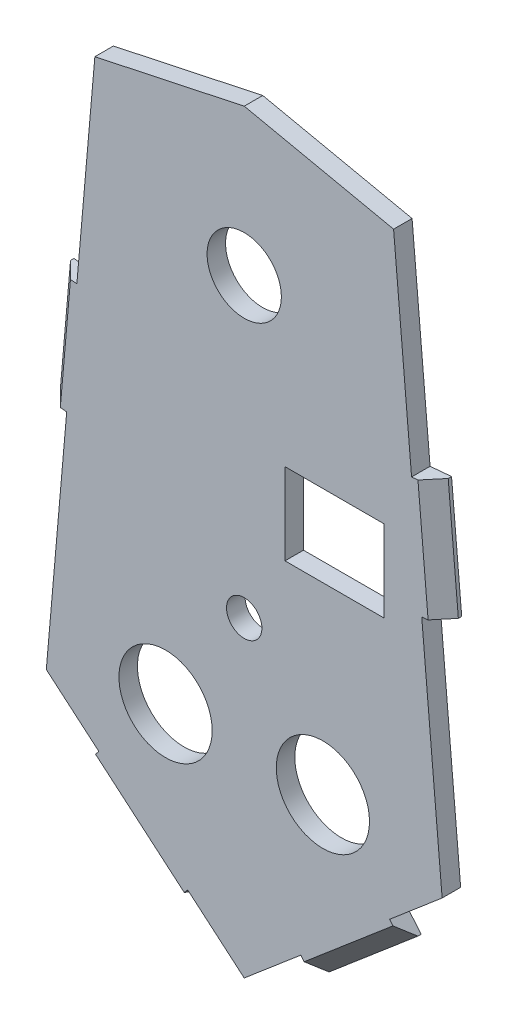
ISO-10303-21;
HEADER;
FILE_DESCRIPTION(('STEP AP214'),'2;1');
FILE_NAME('part.step','',(''),(''),'','','');
FILE_SCHEMA(('AUTOMOTIVE_DESIGN { 1 0 10303 214 1 1 1 1 }'));
ENDSEC;
DATA;
#1=APPLICATION_CONTEXT('core data for automotive mechanical design processes');
#2=APPLICATION_PROTOCOL_DEFINITION('international standard','automotive_design',2000,#1);
#3=PRODUCT_CONTEXT('',#1,'mechanical');
#4=PRODUCT('Part','Part','',(#3));
#5=PRODUCT_RELATED_PRODUCT_CATEGORY('part','',(#4));
#6=PRODUCT_DEFINITION_FORMATION('','',#4);
#7=PRODUCT_DEFINITION_CONTEXT('part definition',#1,'design');
#8=PRODUCT_DEFINITION('design','',#6,#7);
#9=PRODUCT_DEFINITION_SHAPE('','',#8);
#10=(LENGTH_UNIT() NAMED_UNIT(*) SI_UNIT(.MILLI.,.METRE.));
#11=(NAMED_UNIT(*) PLANE_ANGLE_UNIT() SI_UNIT($,.RADIAN.));
#12=(NAMED_UNIT(*) SI_UNIT($,.STERADIAN.) SOLID_ANGLE_UNIT());
#13=UNCERTAINTY_MEASURE_WITH_UNIT(LENGTH_MEASURE(1.E-05),#10,'distance_accuracy_value','');
#14=(GEOMETRIC_REPRESENTATION_CONTEXT(3) GLOBAL_UNCERTAINTY_ASSIGNED_CONTEXT((#13)) GLOBAL_UNIT_ASSIGNED_CONTEXT((#10,
#11,#12)) REPRESENTATION_CONTEXT('',''));
#15=CARTESIAN_POINT('',(0.,0.,0.));
#16=DIRECTION('',(0.,0.,1.));
#17=DIRECTION('',(1.,0.,0.));
#18=AXIS2_PLACEMENT_3D('',#15,#16,#17);
#19=CARTESIAN_POINT('',(30.5992695588796,2.67708919857576,3.175));
#20=DIRECTION('',(-0.996194698091746,-0.0871557427476548,0.));
#21=DIRECTION('',(0.0871557427476548,-0.996194698091746,0.));
#22=AXIS2_PLACEMENT_3D('',#19,#20,#21);
#23=PLANE('',#22);
#24=DIRECTION('',(-0.0871557427476548,0.996194698091746,0.));
#25=VECTOR('',#24,1.);
#26=CARTESIAN_POINT('',(30.5992695588796,2.67708919857576,0.));
#27=LINE('',#26,#25);
#28=CARTESIAN_POINT('',(33.9676308380893,-35.8234563973893,0.));
#29=VERTEX_POINT('',#28);
#30=CARTESIAN_POINT('',(30.4648415370611,4.21360851891802,0.));
#31=VERTEX_POINT('',#30);
#32=EDGE_CURVE('E337',#29,#31,#27,.T.);
#33=ORIENTED_EDGE('',*,*,#32,.T.);
#34=DIRECTION('',(0.,0.,-1.));
#35=VECTOR('',#34,1.);
#36=CARTESIAN_POINT('',(30.4648415370611,4.21360851891802,3.175));
#37=LINE('',#36,#35);
#38=CARTESIAN_POINT('',(30.4648415370611,4.21360851891802,3.175));
#39=VERTEX_POINT('',#38);
#40=EDGE_CURVE('E480',#39,#31,#37,.T.);
#41=ORIENTED_EDGE('',*,*,#40,.F.);
#42=DIRECTION('',(-0.0871557427476548,0.996194698091746,0.));
#43=VECTOR('',#42,1.);
#44=CARTESIAN_POINT('',(30.5992695588796,2.67708919857576,3.175));
#45=LINE('',#44,#43);
#46=CARTESIAN_POINT('',(33.9676308380893,-35.8234563973893,3.175));
#47=VERTEX_POINT('',#46);
#48=EDGE_CURVE('E285',#47,#39,#45,.T.);
#49=ORIENTED_EDGE('',*,*,#48,.F.);
#50=DIRECTION('',(0.,0.,-1.));
#51=VECTOR('',#50,1.);
#52=CARTESIAN_POINT('',(33.9676308380893,-35.8234563973893,3.175));
#53=LINE('',#52,#51);
#54=EDGE_CURVE('E405',#47,#29,#53,.T.);
#55=ORIENTED_EDGE('',*,*,#54,.T.);
#56=EDGE_LOOP('',(#33,#41,#49,#55));
#57=FACE_BOUND('',#56,.T.);
#58=ADVANCED_FACE('F48',(#57),#23,.F.);
#59=CARTESIAN_POINT('',(-0.1344280218185,1.53651932034224,3.175));
#60=DIRECTION('',(0.0871557427476553,-0.996194698091746,0.));
#61=DIRECTION('',(0.996194698091746,0.0871557427476553,0.));
#62=AXIS2_PLACEMENT_3D('',#59,#60,#61);
#63=PLANE('',#62);
#64=DIRECTION('',(0.,0.,-1.));
#65=VECTOR('',#64,1.);
#66=CARTESIAN_POINT('',(34.1507619200005,4.53608476708434,3.175));
#67=LINE('',#66,#65);
#68=CARTESIAN_POINT('',(34.1507619200005,4.53608476708434,0.57500000000001));
#69=VERTEX_POINT('',#68);
#70=CARTESIAN_POINT('',(34.1507619200005,4.53608476708434,0.));
#71=VERTEX_POINT('',#70);
#72=EDGE_CURVE('E477',#69,#71,#67,.T.);
#73=ORIENTED_EDGE('',*,*,#72,.F.);
#74=DIRECTION('',(0.70441602640276,0.0616284167162174,-0.707106781186546));
#75=VECTOR('',#74,1.);
#76=CARTESIAN_POINT('',(15.7131138415717,2.92299957814134,19.0830768987698));
#77=LINE('',#76,#75);
#78=CARTESIAN_POINT('',(31.560655704962,4.30947983594044,3.175));
#79=VERTEX_POINT('',#78);
#80=EDGE_CURVE('E511',#69,#79,#77,.F.);
#81=ORIENTED_EDGE('',*,*,#80,.T.);
#82=DIRECTION('',(-0.996194698091746,-0.0871557427476553,0.));
#83=VECTOR('',#82,1.);
#84=CARTESIAN_POINT('',(-0.1344280218185,1.53651932034224,3.175));
#85=LINE('',#84,#83);
#86=EDGE_CURVE('E289',#79,#39,#85,.T.);
#87=ORIENTED_EDGE('',*,*,#86,.T.);
#88=ORIENTED_EDGE('',*,*,#40,.T.);
#89=DIRECTION('',(-0.996194698091746,-0.0871557427476553,0.));
#90=VECTOR('',#89,1.);
#91=CARTESIAN_POINT('',(-0.1344280218185,1.53651932034224,0.));
#92=LINE('',#91,#90);
#93=EDGE_CURVE('E341',#71,#31,#92,.T.);
#94=ORIENTED_EDGE('',*,*,#93,.F.);
#95=EDGE_LOOP('',(#73,#81,#87,#88,#94));
#96=FACE_BOUND('',#95,.T.);
#97=ADVANCED_FACE('F655',(#96),#63,.T.);
#98=CARTESIAN_POINT('',(34.285189941819,2.99956544674209,3.175));
#99=DIRECTION('',(0.996194698091746,0.0871557427476549,0.));
#100=DIRECTION('',(-0.0871557427476549,0.996194698091746,0.));
#101=AXIS2_PLACEMENT_3D('',#98,#99,#100);
#102=PLANE('',#101);
#103=DIRECTION('',(0.,0.,-1.));
#104=VECTOR('',#103,1.);
#105=CARTESIAN_POINT('',(32.4076470650474,24.4599787289193,3.175));
#106=LINE('',#105,#104);
#107=CARTESIAN_POINT('',(32.4076470650474,24.4599787289193,0.57500000000001));
#108=VERTEX_POINT('',#107);
#109=CARTESIAN_POINT('',(32.4076470650474,24.4599787289193,0.));
#110=VERTEX_POINT('',#109);
#111=EDGE_CURVE('E474',#108,#110,#106,.T.);
#112=ORIENTED_EDGE('',*,*,#111,.F.);
#113=DIRECTION('',(0.0871557427476549,-0.996194698091746,0.));
#114=VECTOR('',#113,1.);
#115=CARTESIAN_POINT('',(34.285189941819,2.99956544674209,0.57500000000001));
#116=LINE('',#115,#114);
#117=EDGE_CURVE('E507',#108,#69,#116,.T.);
#118=ORIENTED_EDGE('',*,*,#117,.T.);
#119=ORIENTED_EDGE('',*,*,#72,.T.);
#120=DIRECTION('',(0.0871557427476549,-0.996194698091746,0.));
#121=VECTOR('',#120,1.);
#122=CARTESIAN_POINT('',(34.285189941819,2.99956544674209,0.));
#123=LINE('',#122,#121);
#124=EDGE_CURVE('E347',#110,#71,#123,.T.);
#125=ORIENTED_EDGE('',*,*,#124,.F.);
#126=EDGE_LOOP('',(#112,#118,#119,#125));
#127=FACE_BOUND('',#126,.T.);
#128=ADVANCED_FACE('F662',(#127),#102,.T.);
#129=CARTESIAN_POINT('',(-1.8775428767716,21.4604132821772,3.175));
#130=DIRECTION('',(-0.0871557427476548,0.996194698091746,0.));
#131=DIRECTION('',(-0.996194698091746,-0.0871557427476548,0.));
#132=AXIS2_PLACEMENT_3D('',#129,#130,#131);
#133=PLANE('',#132);
#134=DIRECTION('',(0.996194698091746,0.0871557427476548,0.));
#135=VECTOR('',#134,1.);
#136=CARTESIAN_POINT('',(-1.8775428767716,21.4604132821772,3.175));
#137=LINE('',#136,#135);
#138=CARTESIAN_POINT('',(28.721726682108,24.1375024807529,3.175));
#139=VERTEX_POINT('',#138);
#140=CARTESIAN_POINT('',(29.8175408500089,24.2333737977754,3.175));
#141=VERTEX_POINT('',#140);
#142=EDGE_CURVE('E294',#139,#141,#137,.T.);
#143=ORIENTED_EDGE('',*,*,#142,.T.);
#144=DIRECTION('',(-0.70441602640276,-0.0616284167162171,0.707106781186546));
#145=VECTOR('',#144,1.);
#146=CARTESIAN_POINT('',(13.9699989866186,22.8468935399763,19.0830768987698));
#147=LINE('',#146,#145);
#148=EDGE_CURVE('E514',#141,#108,#147,.F.);
#149=ORIENTED_EDGE('',*,*,#148,.T.);
#150=ORIENTED_EDGE('',*,*,#111,.T.);
#151=DIRECTION('',(0.996194698091746,0.0871557427476548,0.));
#152=VECTOR('',#151,1.);
#153=CARTESIAN_POINT('',(-1.8775428767716,21.4604132821772,0.));
#154=LINE('',#153,#152);
#155=CARTESIAN_POINT('',(28.721726682108,24.1375024807529,0.));
#156=VERTEX_POINT('',#155);
#157=EDGE_CURVE('E351',#156,#110,#154,.T.);
#158=ORIENTED_EDGE('',*,*,#157,.F.);
#159=DIRECTION('',(0.,0.,-1.));
#160=VECTOR('',#159,1.);
#161=CARTESIAN_POINT('',(28.721726682108,24.1375024807529,3.175));
#162=LINE('',#161,#160);
#163=EDGE_CURVE('E471',#139,#156,#162,.T.);
#164=ORIENTED_EDGE('',*,*,#163,.F.);
#165=EDGE_LOOP('',(#143,#149,#150,#158,#164));
#166=FACE_BOUND('',#165,.T.);
#167=ADVANCED_FACE('F667',(#166),#133,.T.);
#168=CARTESIAN_POINT('',(25.6343918200051,59.4259014307288,0.));
#169=VERTEX_POINT('',#168);
#170=EDGE_CURVE('E343',#156,#169,#27,.T.);
#171=ORIENTED_EDGE('',*,*,#170,.T.);
#172=DIRECTION('',(0.,0.,-1.));
#173=VECTOR('',#172,1.);
#174=CARTESIAN_POINT('',(25.6343918200051,59.4259014307288,3.175));
#175=LINE('',#174,#173);
#176=CARTESIAN_POINT('',(25.6343918200051,59.4259014307288,3.175));
#177=VERTEX_POINT('',#176);
#178=EDGE_CURVE('E467',#177,#169,#175,.T.);
#179=ORIENTED_EDGE('',*,*,#178,.F.);
#180=EDGE_CURVE('E291',#139,#177,#45,.T.);
#181=ORIENTED_EDGE('',*,*,#180,.F.);
#182=ORIENTED_EDGE('',*,*,#163,.T.);
#183=EDGE_LOOP('',(#171,#179,#181,#182));
#184=FACE_BOUND('',#183,.T.);
#185=ADVANCED_FACE('F627',(#184),#23,.F.);
#186=CARTESIAN_POINT('',(13.2273349663387,62.0698933577639,3.175));
#187=DIRECTION('',(-0.208423819180372,-0.978038604349679,0.));
#188=DIRECTION('',(0.978038604349679,-0.208423819180372,0.));
#189=AXIS2_PLACEMENT_3D('',#186,#187,#188);
#190=PLANE('',#189);
#191=DIRECTION('',(-0.978038604349679,0.208423819180372,0.));
#192=VECTOR('',#191,1.);
#193=CARTESIAN_POINT('',(13.2273349663387,62.0698933577639,0.));
#194=LINE('',#193,#192);
#195=CARTESIAN_POINT('',(0.,64.8886897314464,0.));
#196=VERTEX_POINT('',#195);
#197=EDGE_CURVE('E355',#169,#196,#194,.T.);
#198=ORIENTED_EDGE('',*,*,#197,.T.);
#199=DIRECTION('',(0.,0.,-1.));
#200=VECTOR('',#199,1.);
#201=CARTESIAN_POINT('',(0.,64.8886897314464,3.175));
#202=LINE('',#201,#200);
#203=CARTESIAN_POINT('',(0.,64.8886897314464,3.175));
#204=VERTEX_POINT('',#203);
#205=EDGE_CURVE('E463',#204,#196,#202,.T.);
#206=ORIENTED_EDGE('',*,*,#205,.F.);
#207=DIRECTION('',(-0.978038604349679,0.208423819180372,0.));
#208=VECTOR('',#207,1.);
#209=CARTESIAN_POINT('',(13.2273349663387,62.0698933577639,3.175));
#210=LINE('',#209,#208);
#211=EDGE_CURVE('E298',#177,#204,#210,.T.);
#212=ORIENTED_EDGE('',*,*,#211,.F.);
#213=ORIENTED_EDGE('',*,*,#178,.T.);
#214=EDGE_LOOP('',(#198,#206,#212,#213));
#215=FACE_BOUND('',#214,.T.);
#216=ADVANCED_FACE('F633',(#215),#190,.F.);
#217=CARTESIAN_POINT('',(-13.2273349663387,62.0698933577639,3.175));
#218=DIRECTION('',(0.208423819180372,-0.978038604349679,0.));
#219=DIRECTION('',(0.978038604349679,0.208423819180372,0.));
#220=AXIS2_PLACEMENT_3D('',#217,#218,#219);
#221=PLANE('',#220);
#222=DIRECTION('',(-0.978038604349679,-0.208423819180372,0.));
#223=VECTOR('',#222,1.);
#224=CARTESIAN_POINT('',(-13.2273349663387,62.0698933577639,0.));
#225=LINE('',#224,#223);
#226=CARTESIAN_POINT('',(-25.6343918200051,59.4259014307288,0.));
#227=VERTEX_POINT('',#226);
#228=EDGE_CURVE('E358',#196,#227,#225,.T.);
#229=ORIENTED_EDGE('',*,*,#228,.T.);
#230=DIRECTION('',(0.,0.,-1.));
#231=VECTOR('',#230,1.);
#232=CARTESIAN_POINT('',(-25.6343918200051,59.4259014307288,3.175));
#233=LINE('',#232,#231);
#234=CARTESIAN_POINT('',(-25.6343918200051,59.4259014307288,3.175));
#235=VERTEX_POINT('',#234);
#236=EDGE_CURVE('E459',#235,#227,#233,.T.);
#237=ORIENTED_EDGE('',*,*,#236,.F.);
#238=DIRECTION('',(-0.978038604349679,-0.208423819180372,0.));
#239=VECTOR('',#238,1.);
#240=CARTESIAN_POINT('',(-13.2273349663387,62.0698933577639,3.175));
#241=LINE('',#240,#239);
#242=EDGE_CURVE('E301',#204,#235,#241,.T.);
#243=ORIENTED_EDGE('',*,*,#242,.F.);
#244=ORIENTED_EDGE('',*,*,#205,.T.);
#245=EDGE_LOOP('',(#229,#237,#243,#244));
#246=FACE_BOUND('',#245,.T.);
#247=ADVANCED_FACE('F639',(#246),#221,.F.);
#248=CARTESIAN_POINT('',(-30.5992695588795,2.67708919857573,3.175));
#249=DIRECTION('',(0.996194698091746,-0.0871557427476539,0.));
#250=DIRECTION('',(0.0871557427476539,0.996194698091746,0.));
#251=AXIS2_PLACEMENT_3D('',#248,#249,#250);
#252=PLANE('',#251);
#253=DIRECTION('',(-0.0871557427476539,-0.996194698091746,0.));
#254=VECTOR('',#253,1.);
#255=CARTESIAN_POINT('',(-30.5992695588795,2.67708919857573,0.));
#256=LINE('',#255,#254);
#257=CARTESIAN_POINT('',(-28.7217266821079,24.1375024807529,0.));
#258=VERTEX_POINT('',#257);
#259=EDGE_CURVE('E361',#227,#258,#256,.T.);
#260=ORIENTED_EDGE('',*,*,#259,.T.);
#261=DIRECTION('',(0.,0.,-1.));
#262=VECTOR('',#261,1.);
#263=CARTESIAN_POINT('',(-28.7217266821079,24.1375024807529,3.175));
#264=LINE('',#263,#262);
#265=CARTESIAN_POINT('',(-28.7217266821079,24.1375024807529,3.175));
#266=VERTEX_POINT('',#265);
#267=EDGE_CURVE('E455',#266,#258,#264,.T.);
#268=ORIENTED_EDGE('',*,*,#267,.F.);
#269=DIRECTION('',(-0.0871557427476539,-0.996194698091746,0.));
#270=VECTOR('',#269,1.);
#271=CARTESIAN_POINT('',(-30.5992695588795,2.67708919857573,3.175));
#272=LINE('',#271,#270);
#273=EDGE_CURVE('E304',#235,#266,#272,.T.);
#274=ORIENTED_EDGE('',*,*,#273,.F.);
#275=ORIENTED_EDGE('',*,*,#236,.T.);
#276=EDGE_LOOP('',(#260,#268,#274,#275));
#277=FACE_BOUND('',#276,.T.);
#278=ADVANCED_FACE('F642',(#277),#252,.F.);
#279=CARTESIAN_POINT('',(1.87754287677156,21.4604132821772,3.175));
#280=DIRECTION('',(-0.087155742747653,-0.996194698091746,0.));
#281=DIRECTION('',(0.996194698091746,-0.087155742747653,0.));
#282=AXIS2_PLACEMENT_3D('',#279,#280,#281);
#283=PLANE('',#282);
#284=DIRECTION('',(0.,0.,-1.));
#285=VECTOR('',#284,1.);
#286=CARTESIAN_POINT('',(-32.4076470650474,24.4599787289193,3.175));
#287=LINE('',#286,#285);
#288=CARTESIAN_POINT('',(-32.4076470650474,24.4599787289193,0.575000000000022));
#289=VERTEX_POINT('',#288);
#290=CARTESIAN_POINT('',(-32.4076470650474,24.4599787289193,0.));
#291=VERTEX_POINT('',#290);
#292=EDGE_CURVE('E452',#289,#291,#287,.T.);
#293=ORIENTED_EDGE('',*,*,#292,.F.);
#294=DIRECTION('',(0.704416026402759,-0.0616284167162157,0.707106781186548));
#295=VECTOR('',#294,1.);
#296=CARTESIAN_POINT('',(-29.8175408500089,24.2333737977754,3.17499999999999));
#297=LINE('',#296,#295);
#298=CARTESIAN_POINT('',(-29.8175408500089,24.2333737977754,3.175));
#299=VERTEX_POINT('',#298);
#300=EDGE_CURVE('E504',#289,#299,#297,.T.);
#301=ORIENTED_EDGE('',*,*,#300,.T.);
#302=DIRECTION('',(-0.996194698091746,0.087155742747653,0.));
#303=VECTOR('',#302,1.);
#304=CARTESIAN_POINT('',(1.87754287677156,21.4604132821772,3.175));
#305=LINE('',#304,#303);
#306=EDGE_CURVE('E307',#266,#299,#305,.T.);
#307=ORIENTED_EDGE('',*,*,#306,.F.);
#308=ORIENTED_EDGE('',*,*,#267,.T.);
#309=DIRECTION('',(-0.996194698091746,0.087155742747653,0.));
#310=VECTOR('',#309,1.);
#311=CARTESIAN_POINT('',(1.87754287677156,21.4604132821772,0.));
#312=LINE('',#311,#310);
#313=EDGE_CURVE('E364',#258,#291,#312,.T.);
#314=ORIENTED_EDGE('',*,*,#313,.T.);
#315=EDGE_LOOP('',(#293,#301,#307,#308,#314));
#316=FACE_BOUND('',#315,.T.);
#317=ADVANCED_FACE('F643',(#316),#283,.F.);
#318=CARTESIAN_POINT('',(-34.285189941819,2.99956544674203,3.175));
#319=DIRECTION('',(0.996194698091746,-0.0871557427476535,0.));
#320=DIRECTION('',(0.0871557427476535,0.996194698091746,0.));
#321=AXIS2_PLACEMENT_3D('',#318,#319,#320);
#322=PLANE('',#321);
#323=DIRECTION('',(0.,0.,-1.));
#324=VECTOR('',#323,1.);
#325=CARTESIAN_POINT('',(-34.1507619200005,4.53608476708434,3.175));
#326=LINE('',#325,#324);
#327=CARTESIAN_POINT('',(-34.1507619200005,4.53608476708434,0.575000000000022));
#328=VERTEX_POINT('',#327);
#329=CARTESIAN_POINT('',(-34.1507619200005,4.53608476708434,0.));
#330=VERTEX_POINT('',#329);
#331=EDGE_CURVE('E449',#328,#330,#326,.T.);
#332=ORIENTED_EDGE('',*,*,#331,.F.);
#333=DIRECTION('',(0.0871557427476535,0.996194698091746,0.));
#334=VECTOR('',#333,1.);
#335=CARTESIAN_POINT('',(-32.4076470650474,24.4599787289193,0.575000000000022));
#336=LINE('',#335,#334);
#337=EDGE_CURVE('E501',#328,#289,#336,.T.);
#338=ORIENTED_EDGE('',*,*,#337,.T.);
#339=ORIENTED_EDGE('',*,*,#292,.T.);
#340=DIRECTION('',(-0.0871557427476535,-0.996194698091746,0.));
#341=VECTOR('',#340,1.);
#342=CARTESIAN_POINT('',(-34.285189941819,2.99956544674203,0.));
#343=LINE('',#342,#341);
#344=EDGE_CURVE('E369',#291,#330,#343,.T.);
#345=ORIENTED_EDGE('',*,*,#344,.T.);
#346=EDGE_LOOP('',(#332,#338,#339,#345));
#347=FACE_BOUND('',#346,.T.);
#348=ADVANCED_FACE('F604',(#347),#322,.F.);
#349=CARTESIAN_POINT('',(0.134428021818501,1.53651932034229,3.175));
#350=DIRECTION('',(0.087155742747654,0.996194698091746,0.));
#351=DIRECTION('',(-0.996194698091746,0.087155742747654,0.));
#352=AXIS2_PLACEMENT_3D('',#349,#350,#351);
#353=PLANE('',#352);
#354=DIRECTION('',(0.996194698091746,-0.087155742747654,0.));
#355=VECTOR('',#354,1.);
#356=CARTESIAN_POINT('',(0.134428021818501,1.53651932034229,3.175));
#357=LINE('',#356,#355);
#358=CARTESIAN_POINT('',(-31.560655704962,4.30947983594044,3.175));
#359=VERTEX_POINT('',#358);
#360=CARTESIAN_POINT('',(-30.464841537061,4.21360851891802,3.175));
#361=VERTEX_POINT('',#360);
#362=EDGE_CURVE('E312',#359,#361,#357,.T.);
#363=ORIENTED_EDGE('',*,*,#362,.F.);
#364=DIRECTION('',(-0.704416026402759,0.0616284167162164,-0.707106781186548));
#365=VECTOR('',#364,1.);
#366=CARTESIAN_POINT('',(-31.560655704962,4.30947983594044,3.175));
#367=LINE('',#366,#365);
#368=EDGE_CURVE('E498',#359,#328,#367,.T.);
#369=ORIENTED_EDGE('',*,*,#368,.T.);
#370=ORIENTED_EDGE('',*,*,#331,.T.);
#371=DIRECTION('',(0.996194698091746,-0.087155742747654,0.));
#372=VECTOR('',#371,1.);
#373=CARTESIAN_POINT('',(0.134428021818501,1.53651932034229,0.));
#374=LINE('',#373,#372);
#375=CARTESIAN_POINT('',(-30.464841537061,4.21360851891802,0.));
#376=VERTEX_POINT('',#375);
#377=EDGE_CURVE('E373',#330,#376,#374,.T.);
#378=ORIENTED_EDGE('',*,*,#377,.T.);
#379=DIRECTION('',(0.,0.,-1.));
#380=VECTOR('',#379,1.);
#381=CARTESIAN_POINT('',(-30.464841537061,4.21360851891802,3.175));
#382=LINE('',#381,#380);
#383=EDGE_CURVE('E445',#361,#376,#382,.T.);
#384=ORIENTED_EDGE('',*,*,#383,.F.);
#385=EDGE_LOOP('',(#363,#369,#370,#378,#384));
#386=FACE_BOUND('',#385,.T.);
#387=ADVANCED_FACE('F601',(#386),#353,.F.);
#388=CARTESIAN_POINT('',(-33.9676308380892,-35.8234563973893,0.));
#389=VERTEX_POINT('',#388);
#390=EDGE_CURVE('E365',#376,#389,#256,.T.);
#391=ORIENTED_EDGE('',*,*,#390,.T.);
#392=DIRECTION('',(0.,0.,-1.));
#393=VECTOR('',#392,1.);
#394=CARTESIAN_POINT('',(-33.9676308380892,-35.8234563973893,3.175));
#395=LINE('',#394,#393);
#396=CARTESIAN_POINT('',(-33.9676308380892,-35.8234563973893,3.175));
#397=VERTEX_POINT('',#396);
#398=EDGE_CURVE('E441',#397,#389,#395,.T.);
#399=ORIENTED_EDGE('',*,*,#398,.F.);
#400=EDGE_CURVE('E308',#361,#397,#272,.T.);
#401=ORIENTED_EDGE('',*,*,#400,.F.);
#402=ORIENTED_EDGE('',*,*,#383,.T.);
#403=EDGE_LOOP('',(#391,#399,#401,#402));
#404=FACE_BOUND('',#403,.T.);
#405=ADVANCED_FACE('F615',(#404),#252,.F.);
#406=CARTESIAN_POINT('',(-31.922317355983,-37.5616939272189,3.175));
#407=DIRECTION('',(0.647588089129566,0.761990594966577,0.));
#408=DIRECTION('',(-0.761990594966577,0.647588089129566,0.));
#409=AXIS2_PLACEMENT_3D('',#406,#407,#408);
#410=PLANE('',#409);
#411=DIRECTION('',(0.761990594966577,-0.647588089129566,0.));
#412=VECTOR('',#411,1.);
#413=CARTESIAN_POINT('',(-31.922317355983,-37.5616939272189,0.));
#414=LINE('',#413,#412);
#415=CARTESIAN_POINT('',(-24.9380422877353,-43.4973752535746,0.));
#416=VERTEX_POINT('',#415);
#417=EDGE_CURVE('E376',#389,#416,#414,.T.);
#418=ORIENTED_EDGE('',*,*,#417,.T.);
#419=DIRECTION('',(0.,0.,-1.));
#420=VECTOR('',#419,1.);
#421=CARTESIAN_POINT('',(-24.9380422877353,-43.4973752535746,3.175));
#422=LINE('',#421,#420);
#423=CARTESIAN_POINT('',(-24.9380422877353,-43.4973752535746,3.175));
#424=VERTEX_POINT('',#423);
#425=EDGE_CURVE('E437',#424,#416,#422,.T.);
#426=ORIENTED_EDGE('',*,*,#425,.F.);
#427=DIRECTION('',(0.761990594966577,-0.647588089129566,0.));
#428=VECTOR('',#427,1.);
#429=CARTESIAN_POINT('',(-31.922317355983,-37.5616939272189,3.175));
#430=LINE('',#429,#428);
#431=EDGE_CURVE('E315',#397,#424,#430,.T.);
#432=ORIENTED_EDGE('',*,*,#431,.F.);
#433=ORIENTED_EDGE('',*,*,#398,.T.);
#434=EDGE_LOOP('',(#418,#426,#432,#433));
#435=FACE_BOUND('',#434,.T.);
#436=ADVANCED_FACE('F758',(#435),#410,.F.);
#437=CARTESIAN_POINT('',(6.98427506824771,-5.93568132635574,3.175));
#438=DIRECTION('',(0.761990594966576,-0.647588089129567,0.));
#439=DIRECTION('',(0.647588089129567,0.761990594966576,0.));
#440=AXIS2_PLACEMENT_3D('',#437,#438,#439);
#441=PLANE('',#440);
#442=DIRECTION('',(0.,0.,-1.));
#443=VECTOR('',#442,1.);
#444=CARTESIAN_POINT('',(-27.2046005996888,-46.1643423359576,3.175));
#445=LINE('',#444,#443);
#446=CARTESIAN_POINT('',(-27.2046005996888,-46.1643423359576,0.574999999999994));
#447=VERTEX_POINT('',#446);
#448=CARTESIAN_POINT('',(-27.2046005996888,-46.1643423359576,0.));
#449=VERTEX_POINT('',#448);
#450=EDGE_CURVE('E434',#447,#449,#445,.T.);
#451=ORIENTED_EDGE('',*,*,#450,.F.);
#452=DIRECTION('',(0.457913929239153,0.538808716901236,0.70710678118655));
#453=VECTOR('',#452,1.);
#454=CARTESIAN_POINT('',(-25.5208715679519,-44.1831667890446,3.17499999999993));
#455=LINE('',#454,#453);
#456=CARTESIAN_POINT('',(-25.5208715679519,-44.1831667890445,3.175));
#457=VERTEX_POINT('',#456);
#458=EDGE_CURVE('E532',#447,#457,#455,.T.);
#459=ORIENTED_EDGE('',*,*,#458,.T.);
#460=DIRECTION('',(-0.647588089129567,-0.761990594966576,0.));
#461=VECTOR('',#460,1.);
#462=CARTESIAN_POINT('',(6.98427506824771,-5.93568132635574,3.175));
#463=LINE('',#462,#461);
#464=EDGE_CURVE('E318',#424,#457,#463,.T.);
#465=ORIENTED_EDGE('',*,*,#464,.F.);
#466=ORIENTED_EDGE('',*,*,#425,.T.);
#467=DIRECTION('',(-0.647588089129567,-0.761990594966576,0.));
#468=VECTOR('',#467,1.);
#469=CARTESIAN_POINT('',(6.98427506824771,-5.93568132635574,0.));
#470=LINE('',#469,#468);
#471=EDGE_CURVE('E379',#416,#449,#470,.T.);
#472=ORIENTED_EDGE('',*,*,#471,.T.);
#473=EDGE_LOOP('',(#451,#459,#465,#466,#472));
#474=FACE_BOUND('',#473,.T.);
#475=ADVANCED_FACE('F766',(#474),#441,.F.);
#476=CARTESIAN_POINT('',(-34.1888756679359,-40.2286610096025,3.175));
#477=DIRECTION('',(0.647588089129556,0.761990594966585,0.));
#478=DIRECTION('',(-0.761990594966585,0.647588089129556,0.));
#479=AXIS2_PLACEMENT_3D('',#476,#477,#478);
#480=PLANE('',#479);
#481=DIRECTION('',(0.,0.,-1.));
#482=VECTOR('',#481,1.);
#483=CARTESIAN_POINT('',(-11.964788700357,-59.1161041185487,3.175));
#484=LINE('',#483,#482);
#485=CARTESIAN_POINT('',(-11.964788700357,-59.1161041185487,0.574999999999994));
#486=VERTEX_POINT('',#485);
#487=CARTESIAN_POINT('',(-11.964788700357,-59.1161041185487,0.));
#488=VERTEX_POINT('',#487);
#489=EDGE_CURVE('E431',#486,#488,#484,.T.);
#490=ORIENTED_EDGE('',*,*,#489,.F.);
#491=DIRECTION('',(-0.761990594966585,0.647588089129556,0.));
#492=VECTOR('',#491,1.);
#493=CARTESIAN_POINT('',(-27.2046005996887,-46.1643423359576,0.574999999999994));
#494=LINE('',#493,#492);
#495=EDGE_CURVE('E529',#486,#447,#494,.T.);
#496=ORIENTED_EDGE('',*,*,#495,.T.);
#497=ORIENTED_EDGE('',*,*,#450,.T.);
#498=DIRECTION('',(0.761990594966585,-0.647588089129556,0.));
#499=VECTOR('',#498,1.);
#500=CARTESIAN_POINT('',(-34.1888756679359,-40.2286610096025,0.));
#501=LINE('',#500,#499);
#502=EDGE_CURVE('E384',#449,#488,#501,.T.);
#503=ORIENTED_EDGE('',*,*,#502,.T.);
#504=EDGE_LOOP('',(#490,#496,#497,#503));
#505=FACE_BOUND('',#504,.T.);
#506=ADVANCED_FACE('F763',(#505),#480,.F.);
#507=CARTESIAN_POINT('',(22.2240869675792,-18.887443108947,3.175));
#508=DIRECTION('',(-0.761990594966577,0.647588089129566,0.));
#509=DIRECTION('',(-0.647588089129566,-0.761990594966577,0.));
#510=AXIS2_PLACEMENT_3D('',#507,#508,#509);
#511=PLANE('',#510);
#512=DIRECTION('',(0.647588089129566,0.761990594966577,0.));
#513=VECTOR('',#512,1.);
#514=CARTESIAN_POINT('',(22.2240869675792,-18.887443108947,3.175));
#515=LINE('',#514,#513);
#516=CARTESIAN_POINT('',(-10.2810596686202,-57.1349285716356,3.175));
#517=VERTEX_POINT('',#516);
#518=CARTESIAN_POINT('',(-9.69823038840377,-56.4491370361659,3.175));
#519=VERTEX_POINT('',#518);
#520=EDGE_CURVE('E323',#517,#519,#515,.T.);
#521=ORIENTED_EDGE('',*,*,#520,.F.);
#522=DIRECTION('',(-0.457913929239153,-0.538808716901236,-0.70710678118655));
#523=VECTOR('',#522,1.);
#524=CARTESIAN_POINT('',(-10.2810596686203,-57.1349285716358,3.1749999999998));
#525=LINE('',#524,#523);
#526=EDGE_CURVE('E526',#517,#486,#525,.T.);
#527=ORIENTED_EDGE('',*,*,#526,.T.);
#528=ORIENTED_EDGE('',*,*,#489,.T.);
#529=DIRECTION('',(0.647588089129566,0.761990594966577,0.));
#530=VECTOR('',#529,1.);
#531=CARTESIAN_POINT('',(22.2240869675792,-18.887443108947,0.));
#532=LINE('',#531,#530);
#533=CARTESIAN_POINT('',(-9.69823038840377,-56.4491370361659,0.));
#534=VERTEX_POINT('',#533);
#535=EDGE_CURVE('E388',#488,#534,#532,.T.);
#536=ORIENTED_EDGE('',*,*,#535,.T.);
#537=DIRECTION('',(0.,0.,-1.));
#538=VECTOR('',#537,1.);
#539=CARTESIAN_POINT('',(-9.69823038840377,-56.4491370361659,3.175));
#540=LINE('',#539,#538);
#541=EDGE_CURVE('E427',#519,#534,#540,.T.);
#542=ORIENTED_EDGE('',*,*,#541,.F.);
#543=EDGE_LOOP('',(#521,#527,#528,#536,#542));
#544=FACE_BOUND('',#543,.T.);
#545=ADVANCED_FACE('F755',(#544),#511,.F.);
#546=CARTESIAN_POINT('',(0.,-64.6913102685536,0.));
#547=VERTEX_POINT('',#546);
#548=EDGE_CURVE('E380',#534,#547,#414,.T.);
#549=ORIENTED_EDGE('',*,*,#548,.T.);
#550=DIRECTION('',(0.,0.,-1.));
#551=VECTOR('',#550,1.);
#552=CARTESIAN_POINT('',(0.,-64.6913102685536,3.175));
#553=LINE('',#552,#551);
#554=CARTESIAN_POINT('',(0.,-64.6913102685536,3.175));
#555=VERTEX_POINT('',#554);
#556=EDGE_CURVE('E423',#555,#547,#553,.T.);
#557=ORIENTED_EDGE('',*,*,#556,.F.);
#558=EDGE_CURVE('E319',#519,#555,#430,.T.);
#559=ORIENTED_EDGE('',*,*,#558,.F.);
#560=ORIENTED_EDGE('',*,*,#541,.T.);
#561=EDGE_LOOP('',(#549,#557,#559,#560));
#562=FACE_BOUND('',#561,.T.);
#563=ADVANCED_FACE('F749',(#562),#410,.F.);
#564=CARTESIAN_POINT('',(31.922317355983,-37.561693927219,3.175));
#565=DIRECTION('',(-0.647588089129565,0.761990594966577,0.));
#566=DIRECTION('',(-0.761990594966578,-0.647588089129565,0.));
#567=AXIS2_PLACEMENT_3D('',#564,#565,#566);
#568=PLANE('',#567);
#569=DIRECTION('',(0.761990594966578,0.647588089129565,0.));
#570=VECTOR('',#569,1.);
#571=CARTESIAN_POINT('',(31.922317355983,-37.561693927219,0.));
#572=LINE('',#571,#570);
#573=CARTESIAN_POINT('',(9.69823038840384,-56.4491370361659,0.));
#574=VERTEX_POINT('',#573);
#575=EDGE_CURVE('E391',#547,#574,#572,.T.);
#576=ORIENTED_EDGE('',*,*,#575,.T.);
#577=DIRECTION('',(0.,0.,-1.));
#578=VECTOR('',#577,1.);
#579=CARTESIAN_POINT('',(9.69823038840384,-56.4491370361659,3.175));
#580=LINE('',#579,#578);
#581=CARTESIAN_POINT('',(9.69823038840384,-56.4491370361659,3.175));
#582=VERTEX_POINT('',#581);
#583=EDGE_CURVE('E419',#582,#574,#580,.T.);
#584=ORIENTED_EDGE('',*,*,#583,.F.);
#585=DIRECTION('',(0.761990594966578,0.647588089129565,0.));
#586=VECTOR('',#585,1.);
#587=CARTESIAN_POINT('',(31.922317355983,-37.561693927219,3.175));
#588=LINE('',#587,#586);
#589=EDGE_CURVE('E326',#555,#582,#588,.T.);
#590=ORIENTED_EDGE('',*,*,#589,.F.);
#591=ORIENTED_EDGE('',*,*,#556,.T.);
#592=EDGE_LOOP('',(#576,#584,#590,#591));
#593=FACE_BOUND('',#592,.T.);
#594=ADVANCED_FACE('F713',(#593),#568,.F.);
#595=CARTESIAN_POINT('',(-22.2240869675791,-18.8874431089468,3.175));
#596=DIRECTION('',(0.761990594966578,0.647588089129564,0.));
#597=DIRECTION('',(-0.647588089129564,0.761990594966578,0.));
#598=AXIS2_PLACEMENT_3D('',#595,#596,#597);
#599=PLANE('',#598);
#600=DIRECTION('',(0.,0.,-1.));
#601=VECTOR('',#600,1.);
#602=CARTESIAN_POINT('',(11.9647887003573,-59.1161041185489,3.175));
#603=LINE('',#602,#601);
#604=CARTESIAN_POINT('',(11.9647887003573,-59.1161041185489,0.575000000000019));
#605=VERTEX_POINT('',#604);
#606=CARTESIAN_POINT('',(11.9647887003573,-59.1161041185489,0.));
#607=VERTEX_POINT('',#606);
#608=EDGE_CURVE('E416',#605,#607,#603,.T.);
#609=ORIENTED_EDGE('',*,*,#608,.F.);
#610=DIRECTION('',(-0.457913929239153,0.538808716901239,0.707106781186548));
#611=VECTOR('',#610,1.);
#612=CARTESIAN_POINT('',(10.2810596686204,-57.1349285716358,3.17499999999998));
#613=LINE('',#612,#611);
#614=CARTESIAN_POINT('',(10.2810596686204,-57.1349285716358,3.175));
#615=VERTEX_POINT('',#614);
#616=EDGE_CURVE('E523',#605,#615,#613,.T.);
#617=ORIENTED_EDGE('',*,*,#616,.T.);
#618=DIRECTION('',(0.647588089129564,-0.761990594966578,0.));
#619=VECTOR('',#618,1.);
#620=CARTESIAN_POINT('',(-22.2240869675791,-18.8874431089468,3.175));
#621=LINE('',#620,#619);
#622=EDGE_CURVE('E329',#582,#615,#621,.T.);
#623=ORIENTED_EDGE('',*,*,#622,.F.);
#624=ORIENTED_EDGE('',*,*,#583,.T.);
#625=DIRECTION('',(0.647588089129564,-0.761990594966578,0.));
#626=VECTOR('',#625,1.);
#627=CARTESIAN_POINT('',(-22.2240869675791,-18.8874431089468,0.));
#628=LINE('',#627,#626);
#629=EDGE_CURVE('E394',#574,#607,#628,.T.);
#630=ORIENTED_EDGE('',*,*,#629,.T.);
#631=EDGE_LOOP('',(#609,#617,#623,#624,#630));
#632=FACE_BOUND('',#631,.T.);
#633=ADVANCED_FACE('F706',(#632),#599,.F.);
#634=CARTESIAN_POINT('',(34.1888756679364,-40.2286610096021,3.175));
#635=DIRECTION('',(-0.647588089129563,0.761990594966579,0.));
#636=DIRECTION('',(-0.761990594966579,-0.647588089129563,0.));
#637=AXIS2_PLACEMENT_3D('',#634,#635,#636);
#638=PLANE('',#637);
#639=DIRECTION('',(0.,0.,-1.));
#640=VECTOR('',#639,1.);
#641=CARTESIAN_POINT('',(27.2046005996889,-46.1643423359576,3.175));
#642=LINE('',#641,#640);
#643=CARTESIAN_POINT('',(27.2046005996889,-46.1643423359576,0.575000000000019));
#644=VERTEX_POINT('',#643);
#645=CARTESIAN_POINT('',(27.2046005996889,-46.1643423359576,0.));
#646=VERTEX_POINT('',#645);
#647=EDGE_CURVE('E413',#644,#646,#642,.T.);
#648=ORIENTED_EDGE('',*,*,#647,.F.);
#649=DIRECTION('',(-0.761990594966579,-0.647588089129563,0.));
#650=VECTOR('',#649,1.);
#651=CARTESIAN_POINT('',(11.9647887003573,-59.1161041185489,0.575000000000019));
#652=LINE('',#651,#650);
#653=EDGE_CURVE('E520',#644,#605,#652,.T.);
#654=ORIENTED_EDGE('',*,*,#653,.T.);
#655=ORIENTED_EDGE('',*,*,#608,.T.);
#656=DIRECTION('',(0.761990594966579,0.647588089129563,0.));
#657=VECTOR('',#656,1.);
#658=CARTESIAN_POINT('',(34.1888756679364,-40.2286610096021,0.));
#659=LINE('',#658,#657);
#660=EDGE_CURVE('E398',#607,#646,#659,.T.);
#661=ORIENTED_EDGE('',*,*,#660,.T.);
#662=EDGE_LOOP('',(#648,#654,#655,#661));
#663=FACE_BOUND('',#662,.T.);
#664=ADVANCED_FACE('F722',(#663),#638,.F.);
#665=CARTESIAN_POINT('',(-6.98427506824757,-5.9356813263556,3.175));
#666=DIRECTION('',(-0.761990594966577,-0.647588089129565,0.));
#667=DIRECTION('',(0.647588089129565,-0.761990594966578,0.));
#668=AXIS2_PLACEMENT_3D('',#665,#666,#667);
#669=PLANE('',#668);
#670=DIRECTION('',(-0.647588089129565,0.761990594966577,0.));
#671=VECTOR('',#670,1.);
#672=CARTESIAN_POINT('',(-6.98427506824757,-5.9356813263556,3.175));
#673=LINE('',#672,#671);
#674=CARTESIAN_POINT('',(25.520871567952,-44.1831667890446,3.175));
#675=VERTEX_POINT('',#674);
#676=CARTESIAN_POINT('',(24.9380422877354,-43.4973752535746,3.175));
#677=VERTEX_POINT('',#676);
#678=EDGE_CURVE('E334',#675,#677,#673,.T.);
#679=ORIENTED_EDGE('',*,*,#678,.F.);
#680=DIRECTION('',(0.457913929239154,-0.538808716901239,-0.707106781186548));
#681=VECTOR('',#680,1.);
#682=CARTESIAN_POINT('',(25.520871567952,-44.1831667890446,3.17499999999999));
#683=LINE('',#682,#681);
#684=EDGE_CURVE('E517',#675,#644,#683,.T.);
#685=ORIENTED_EDGE('',*,*,#684,.T.);
#686=ORIENTED_EDGE('',*,*,#647,.T.);
#687=DIRECTION('',(-0.647588089129565,0.761990594966577,0.));
#688=VECTOR('',#687,1.);
#689=CARTESIAN_POINT('',(-6.98427506824757,-5.9356813263556,0.));
#690=LINE('',#689,#688);
#691=CARTESIAN_POINT('',(24.9380422877354,-43.4973752535746,0.));
#692=VERTEX_POINT('',#691);
#693=EDGE_CURVE('E402',#646,#692,#690,.T.);
#694=ORIENTED_EDGE('',*,*,#693,.T.);
#695=DIRECTION('',(0.,0.,-1.));
#696=VECTOR('',#695,1.);
#697=CARTESIAN_POINT('',(24.9380422877354,-43.4973752535746,3.175));
#698=LINE('',#697,#696);
#699=EDGE_CURVE('E409',#677,#692,#698,.T.);
#700=ORIENTED_EDGE('',*,*,#699,.F.);
#701=EDGE_LOOP('',(#679,#685,#686,#694,#700));
#702=FACE_BOUND('',#701,.T.);
#703=ADVANCED_FACE('F724',(#702),#669,.F.);
#704=EDGE_CURVE('E290',#692,#29,#572,.T.);
#705=ORIENTED_EDGE('',*,*,#704,.T.);
#706=ORIENTED_EDGE('',*,*,#54,.F.);
#707=EDGE_CURVE('E330',#677,#47,#588,.T.);
#708=ORIENTED_EDGE('',*,*,#707,.F.);
#709=ORIENTED_EDGE('',*,*,#699,.T.);
#710=EDGE_LOOP('',(#705,#706,#708,#709));
#711=FACE_BOUND('',#710,.T.);
#712=ADVANCED_FACE('F583',(#711),#568,.F.);
#713=CARTESIAN_POINT('',(0.,0.,3.175));
#714=DIRECTION('',(0.,0.,1.));
#715=DIRECTION('',(1.,0.,0.));
#716=AXIS2_PLACEMENT_3D('',#713,#714,#715);
#717=PLANE('',#716);
#718=DIRECTION('',(0.,-1.,0.));
#719=VECTOR('',#718,1.);
#720=CARTESIAN_POINT('',(7.00000000000001,14.8086897314464,3.175));
#721=LINE('',#720,#719);
#722=CARTESIAN_POINT('',(7.00000000000001,14.8086897314464,3.175));
#723=VERTEX_POINT('',#722);
#724=CARTESIAN_POINT('',(7.00000000000001,0.80868973144638,3.175));
#725=VERTEX_POINT('',#724);
#726=EDGE_CURVE('E65',#723,#725,#721,.T.);
#727=ORIENTED_EDGE('',*,*,#726,.F.);
#728=DIRECTION('',(-1.,0.,0.));
#729=VECTOR('',#728,1.);
#730=CARTESIAN_POINT('',(7.00000000000001,14.8086897314464,3.175));
#731=LINE('',#730,#729);
#732=CARTESIAN_POINT('',(24.,14.8086897314464,3.175));
#733=VERTEX_POINT('',#732);
#734=EDGE_CURVE('E256',#733,#723,#731,.T.);
#735=ORIENTED_EDGE('',*,*,#734,.F.);
#736=DIRECTION('',(0.,1.,0.));
#737=VECTOR('',#736,1.);
#738=CARTESIAN_POINT('',(24.,14.8086897314464,3.175));
#739=LINE('',#738,#737);
#740=CARTESIAN_POINT('',(24.,0.80868973144638,3.175));
#741=VERTEX_POINT('',#740);
#742=EDGE_CURVE('E263',#741,#733,#739,.T.);
#743=ORIENTED_EDGE('',*,*,#742,.F.);
#744=DIRECTION('',(1.,0.,0.));
#745=VECTOR('',#744,1.);
#746=CARTESIAN_POINT('',(7.00000000000001,0.80868973144638,3.175));
#747=LINE('',#746,#745);
#748=EDGE_CURVE('E269',#725,#741,#747,.T.);
#749=ORIENTED_EDGE('',*,*,#748,.F.);
#750=EDGE_LOOP('',(#727,#735,#743,#749));
#751=FACE_BOUND('',#750,.T.);
#752=CARTESIAN_POINT('',(-13.5,-30.6913102685536,3.175));
#753=DIRECTION('',(0.,0.,1.));
#754=DIRECTION('',(1.,0.,0.));
#755=AXIS2_PLACEMENT_3D('',#752,#753,#754);
#756=CIRCLE('',#755,8.);
#757=CARTESIAN_POINT('',(-5.49999999999999,-30.6913102685536,3.175));
#758=VERTEX_POINT('',#757);
#759=EDGE_CURVE('E253',#758,#758,#756,.T.);
#760=ORIENTED_EDGE('',*,*,#759,.F.);
#761=EDGE_LOOP('',(#760));
#762=FACE_BOUND('',#761,.T.);
#763=CARTESIAN_POINT('',(0.,-11.1913102685536,3.175));
#764=DIRECTION('',(0.,0.,1.));
#765=DIRECTION('',(1.,0.,0.));
#766=AXIS2_PLACEMENT_3D('',#763,#764,#765);
#767=CIRCLE('',#766,3.03324196969818);
#768=CARTESIAN_POINT('',(3.03324196969819,-11.1913102685536,3.175));
#769=VERTEX_POINT('',#768);
#770=EDGE_CURVE('E283',#769,#769,#767,.T.);
#771=ORIENTED_EDGE('',*,*,#770,.F.);
#772=EDGE_LOOP('',(#771));
#773=FACE_BOUND('',#772,.T.);
#774=CARTESIAN_POINT('',(0.,39.7345094415995,3.175));
#775=DIRECTION('',(0.,0.,1.));
#776=DIRECTION('',(1.,0.,0.));
#777=AXIS2_PLACEMENT_3D('',#774,#775,#776);
#778=CIRCLE('',#777,6.375);
#779=CARTESIAN_POINT('',(6.375,39.7345094415995,3.175));
#780=VERTEX_POINT('',#779);
#781=EDGE_CURVE('E570',#780,#780,#778,.T.);
#782=ORIENTED_EDGE('',*,*,#781,.F.);
#783=EDGE_LOOP('',(#782));
#784=FACE_BOUND('',#783,.T.);
#785=CARTESIAN_POINT('',(13.5,-30.6913102685536,3.175));
#786=DIRECTION('',(0.,0.,1.));
#787=DIRECTION('',(1.,0.,0.));
#788=AXIS2_PLACEMENT_3D('',#785,#786,#787);
#789=CIRCLE('',#788,8.);
#790=CARTESIAN_POINT('',(21.5,-30.6913102685536,3.175));
#791=VERTEX_POINT('',#790);
#792=EDGE_CURVE('E271',#791,#791,#789,.T.);
#793=ORIENTED_EDGE('',*,*,#792,.F.);
#794=EDGE_LOOP('',(#793));
#795=FACE_BOUND('',#794,.T.);
#796=ORIENTED_EDGE('',*,*,#306,.T.);
#797=DIRECTION('',(-0.0871557427476535,-0.996194698091746,0.));
#798=VECTOR('',#797,1.);
#799=CARTESIAN_POINT('',(-31.560655704962,4.30947983594044,3.175));
#800=LINE('',#799,#798);
#801=EDGE_CURVE('E494',#299,#359,#800,.T.);
#802=ORIENTED_EDGE('',*,*,#801,.T.);
#803=ORIENTED_EDGE('',*,*,#362,.T.);
#804=ORIENTED_EDGE('',*,*,#400,.T.);
#805=ORIENTED_EDGE('',*,*,#431,.T.);
#806=ORIENTED_EDGE('',*,*,#464,.T.);
#807=DIRECTION('',(0.761990594966585,-0.647588089129556,0.));
#808=VECTOR('',#807,1.);
#809=CARTESIAN_POINT('',(-10.2810596686202,-57.1349285716356,3.175));
#810=LINE('',#809,#808);
#811=EDGE_CURVE('E483',#457,#517,#810,.T.);
#812=ORIENTED_EDGE('',*,*,#811,.T.);
#813=ORIENTED_EDGE('',*,*,#520,.T.);
#814=ORIENTED_EDGE('',*,*,#558,.T.);
#815=ORIENTED_EDGE('',*,*,#589,.T.);
#816=ORIENTED_EDGE('',*,*,#622,.T.);
#817=DIRECTION('',(0.761990594966579,0.647588089129563,0.));
#818=VECTOR('',#817,1.);
#819=CARTESIAN_POINT('',(25.520871567952,-44.1831667890445,3.175));
#820=LINE('',#819,#818);
#821=EDGE_CURVE('E487',#615,#675,#820,.T.);
#822=ORIENTED_EDGE('',*,*,#821,.T.);
#823=ORIENTED_EDGE('',*,*,#678,.T.);
#824=ORIENTED_EDGE('',*,*,#707,.T.);
#825=ORIENTED_EDGE('',*,*,#48,.T.);
#826=ORIENTED_EDGE('',*,*,#86,.F.);
#827=DIRECTION('',(-0.0871557427476549,0.996194698091746,0.));
#828=VECTOR('',#827,1.);
#829=CARTESIAN_POINT('',(31.6950837267805,2.77296051559818,3.175));
#830=LINE('',#829,#828);
#831=EDGE_CURVE('E491',#79,#141,#830,.T.);
#832=ORIENTED_EDGE('',*,*,#831,.T.);
#833=ORIENTED_EDGE('',*,*,#142,.F.);
#834=ORIENTED_EDGE('',*,*,#180,.T.);
#835=ORIENTED_EDGE('',*,*,#211,.T.);
#836=ORIENTED_EDGE('',*,*,#242,.T.);
#837=ORIENTED_EDGE('',*,*,#273,.T.);
#838=EDGE_LOOP('',(#796,#802,#803,#804,#805,#806,#812,#813,#814,#815,#816,#822,#823,#824,#825,
#826,#832,#833,#834,#835,#836,#837));
#839=FACE_BOUND('',#838,.T.);
#840=ADVANCED_FACE('F267',(#751,#762,#773,#784,#795,#839),#717,.T.);
#841=CARTESIAN_POINT('',(0.,0.,0.));
#842=DIRECTION('',(0.,0.,1.));
#843=DIRECTION('',(1.,0.,0.));
#844=AXIS2_PLACEMENT_3D('',#841,#842,#843);
#845=PLANE('',#844);
#846=DIRECTION('',(-1.,0.,0.));
#847=VECTOR('',#846,1.);
#848=CARTESIAN_POINT('',(0.,14.8086897314464,0.));
#849=LINE('',#848,#847);
#850=CARTESIAN_POINT('',(24.,14.8086897314464,0.));
#851=VERTEX_POINT('',#850);
#852=CARTESIAN_POINT('',(7.00000000000001,14.8086897314464,0.));
#853=VERTEX_POINT('',#852);
#854=EDGE_CURVE('E58',#851,#853,#849,.T.);
#855=ORIENTED_EDGE('',*,*,#854,.T.);
#856=DIRECTION('',(0.,-1.,0.));
#857=VECTOR('',#856,1.);
#858=CARTESIAN_POINT('',(7.00000000000001,0.,0.));
#859=LINE('',#858,#857);
#860=CARTESIAN_POINT('',(7.00000000000001,0.80868973144638,0.));
#861=VERTEX_POINT('',#860);
#862=EDGE_CURVE('E11',#853,#861,#859,.T.);
#863=ORIENTED_EDGE('',*,*,#862,.T.);
#864=DIRECTION('',(1.,0.,0.));
#865=VECTOR('',#864,1.);
#866=CARTESIAN_POINT('',(0.,0.80868973144638,0.));
#867=LINE('',#866,#865);
#868=CARTESIAN_POINT('',(24.,0.80868973144638,0.));
#869=VERTEX_POINT('',#868);
#870=EDGE_CURVE('E535',#861,#869,#867,.T.);
#871=ORIENTED_EDGE('',*,*,#870,.T.);
#872=DIRECTION('',(0.,1.,0.));
#873=VECTOR('',#872,1.);
#874=CARTESIAN_POINT('',(24.,0.,0.));
#875=LINE('',#874,#873);
#876=EDGE_CURVE('E553',#869,#851,#875,.T.);
#877=ORIENTED_EDGE('',*,*,#876,.T.);
#878=EDGE_LOOP('',(#855,#863,#871,#877));
#879=FACE_BOUND('',#878,.T.);
#880=CARTESIAN_POINT('',(-13.5,-30.6913102685536,0.));
#881=DIRECTION('',(0.,0.,1.));
#882=DIRECTION('',(1.,0.,0.));
#883=AXIS2_PLACEMENT_3D('',#880,#881,#882);
#884=CIRCLE('',#883,8.);
#885=CARTESIAN_POINT('',(-5.49999999999999,-30.6913102685536,0.));
#886=VERTEX_POINT('',#885);
#887=EDGE_CURVE('E342',#886,#886,#884,.T.);
#888=ORIENTED_EDGE('',*,*,#887,.T.);
#889=EDGE_LOOP('',(#888));
#890=FACE_BOUND('',#889,.T.);
#891=CARTESIAN_POINT('',(0.,-11.1913102685536,0.));
#892=DIRECTION('',(0.,0.,1.));
#893=DIRECTION('',(1.,0.,0.));
#894=AXIS2_PLACEMENT_3D('',#891,#892,#893);
#895=CIRCLE('',#894,3.03324196969818);
#896=CARTESIAN_POINT('',(3.03324196969819,-11.1913102685536,0.));
#897=VERTEX_POINT('',#896);
#898=EDGE_CURVE('E543',#897,#897,#895,.T.);
#899=ORIENTED_EDGE('',*,*,#898,.T.);
#900=EDGE_LOOP('',(#899));
#901=FACE_BOUND('',#900,.T.);
#902=CARTESIAN_POINT('',(0.,39.7345094415995,0.));
#903=DIRECTION('',(0.,0.,1.));
#904=DIRECTION('',(1.,0.,0.));
#905=AXIS2_PLACEMENT_3D('',#902,#903,#904);
#906=CIRCLE('',#905,6.375);
#907=CARTESIAN_POINT('',(6.375,39.7345094415995,0.));
#908=VERTEX_POINT('',#907);
#909=EDGE_CURVE('E539',#908,#908,#906,.T.);
#910=ORIENTED_EDGE('',*,*,#909,.T.);
#911=EDGE_LOOP('',(#910));
#912=FACE_BOUND('',#911,.T.);
#913=CARTESIAN_POINT('',(13.5,-30.6913102685536,0.));
#914=DIRECTION('',(0.,0.,1.));
#915=DIRECTION('',(1.,0.,0.));
#916=AXIS2_PLACEMENT_3D('',#913,#914,#915);
#917=CIRCLE('',#916,8.);
#918=CARTESIAN_POINT('',(21.5,-30.6913102685536,0.));
#919=VERTEX_POINT('',#918);
#920=EDGE_CURVE('E276',#919,#919,#917,.T.);
#921=ORIENTED_EDGE('',*,*,#920,.T.);
#922=EDGE_LOOP('',(#921));
#923=FACE_BOUND('',#922,.T.);
#924=ORIENTED_EDGE('',*,*,#32,.F.);
#925=ORIENTED_EDGE('',*,*,#704,.F.);
#926=ORIENTED_EDGE('',*,*,#693,.F.);
#927=ORIENTED_EDGE('',*,*,#660,.F.);
#928=ORIENTED_EDGE('',*,*,#629,.F.);
#929=ORIENTED_EDGE('',*,*,#575,.F.);
#930=ORIENTED_EDGE('',*,*,#548,.F.);
#931=ORIENTED_EDGE('',*,*,#535,.F.);
#932=ORIENTED_EDGE('',*,*,#502,.F.);
#933=ORIENTED_EDGE('',*,*,#471,.F.);
#934=ORIENTED_EDGE('',*,*,#417,.F.);
#935=ORIENTED_EDGE('',*,*,#390,.F.);
#936=ORIENTED_EDGE('',*,*,#377,.F.);
#937=ORIENTED_EDGE('',*,*,#344,.F.);
#938=ORIENTED_EDGE('',*,*,#313,.F.);
#939=ORIENTED_EDGE('',*,*,#259,.F.);
#940=ORIENTED_EDGE('',*,*,#228,.F.);
#941=ORIENTED_EDGE('',*,*,#197,.F.);
#942=ORIENTED_EDGE('',*,*,#170,.F.);
#943=ORIENTED_EDGE('',*,*,#157,.T.);
#944=ORIENTED_EDGE('',*,*,#124,.T.);
#945=ORIENTED_EDGE('',*,*,#93,.T.);
#946=EDGE_LOOP('',(#924,#925,#926,#927,#928,#929,#930,#931,#932,#933,#934,#935,#936,#937,#938,
#939,#940,#941,#942,#943,#944,#945));
#947=FACE_BOUND('',#946,.T.);
#948=ADVANCED_FACE('F558',(#879,#890,#901,#912,#923,#947),#845,.F.);
#949=CARTESIAN_POINT('',(-31.6950837267805,2.77296051559814,3.175));
#950=DIRECTION('',(-0.704416026402759,0.0616284167162161,0.707106781186547));
#951=DIRECTION('',(0.0871557427476535,0.996194698091746,0.));
#952=AXIS2_PLACEMENT_3D('',#949,#950,#951);
#953=PLANE('',#952);
#954=ORIENTED_EDGE('',*,*,#300,.F.);
#955=ORIENTED_EDGE('',*,*,#337,.F.);
#956=ORIENTED_EDGE('',*,*,#368,.F.);
#957=ORIENTED_EDGE('',*,*,#801,.F.);
#958=EDGE_LOOP('',(#954,#955,#956,#957));
#959=FACE_BOUND('',#958,.T.);
#960=ADVANCED_FACE('F597',(#959),#953,.T.);
#961=CARTESIAN_POINT('',(34.285189941819,2.99956544674209,0.57500000000001));
#962=DIRECTION('',(-0.704416026402758,-0.061628416716217,-0.707106781186549));
#963=DIRECTION('',(0.0871557427476549,-0.996194698091746,0.));
#964=AXIS2_PLACEMENT_3D('',#961,#962,#963);
#965=PLANE('',#964);
#966=ORIENTED_EDGE('',*,*,#148,.F.);
#967=ORIENTED_EDGE('',*,*,#831,.F.);
#968=ORIENTED_EDGE('',*,*,#80,.F.);
#969=ORIENTED_EDGE('',*,*,#117,.F.);
#970=EDGE_LOOP('',(#966,#967,#968,#969));
#971=FACE_BOUND('',#970,.T.);
#972=ADVANCED_FACE('F684',(#971),#965,.F.);
#973=CARTESIAN_POINT('',(32.5051466361995,-38.247485462689,3.175));
#974=DIRECTION('',(0.457913929239153,-0.53880871690124,0.707106781186547));
#975=DIRECTION('',(-0.761990594966579,-0.647588089129563,0.));
#976=AXIS2_PLACEMENT_3D('',#973,#974,#975);
#977=PLANE('',#976);
#978=ORIENTED_EDGE('',*,*,#616,.F.);
#979=ORIENTED_EDGE('',*,*,#653,.F.);
#980=ORIENTED_EDGE('',*,*,#684,.F.);
#981=ORIENTED_EDGE('',*,*,#821,.F.);
#982=EDGE_LOOP('',(#978,#979,#980,#981));
#983=FACE_BOUND('',#982,.T.);
#984=ADVANCED_FACE('F689',(#983),#977,.T.);
#985=CARTESIAN_POINT('',(-32.5051466361991,-38.2474854626894,3.175));
#986=DIRECTION('',(-0.457913929239149,-0.538808716901247,0.707106781186545));
#987=DIRECTION('',(-0.761990594966585,0.647588089129556,0.));
#988=AXIS2_PLACEMENT_3D('',#985,#986,#987);
#989=PLANE('',#988);
#990=ORIENTED_EDGE('',*,*,#458,.F.);
#991=ORIENTED_EDGE('',*,*,#495,.F.);
#992=ORIENTED_EDGE('',*,*,#526,.F.);
#993=ORIENTED_EDGE('',*,*,#811,.F.);
#994=EDGE_LOOP('',(#990,#991,#992,#993));
#995=FACE_BOUND('',#994,.T.);
#996=ADVANCED_FACE('F51',(#995),#989,.T.);
#997=CARTESIAN_POINT('',(13.5,-30.6913102685536,-6.825));
#998=DIRECTION('',(0.,0.,1.));
#999=DIRECTION('',(1.,0.,0.));
#1000=AXIS2_PLACEMENT_3D('',#997,#998,#999);
#1001=CYLINDRICAL_SURFACE('',#1000,8.);
#1002=ORIENTED_EDGE('',*,*,#792,.T.);
#1003=EDGE_LOOP('',(#1002));
#1004=FACE_BOUND('',#1003,.T.);
#1005=ORIENTED_EDGE('',*,*,#920,.F.);
#1006=EDGE_LOOP('',(#1005));
#1007=FACE_BOUND('',#1006,.T.);
#1008=ADVANCED_FACE('F698',(#1004,#1007),#1001,.F.);
#1009=CARTESIAN_POINT('',(0.,39.7345094415995,-6.825));
#1010=DIRECTION('',(0.,0.,1.));
#1011=DIRECTION('',(1.,0.,0.));
#1012=AXIS2_PLACEMENT_3D('',#1009,#1010,#1011);
#1013=CYLINDRICAL_SURFACE('',#1012,6.375);
#1014=ORIENTED_EDGE('',*,*,#781,.T.);
#1015=EDGE_LOOP('',(#1014));
#1016=FACE_BOUND('',#1015,.T.);
#1017=ORIENTED_EDGE('',*,*,#909,.F.);
#1018=EDGE_LOOP('',(#1017));
#1019=FACE_BOUND('',#1018,.T.);
#1020=ADVANCED_FACE('F928',(#1016,#1019),#1013,.F.);
#1021=CARTESIAN_POINT('',(0.,-11.1913102685536,-6.825));
#1022=DIRECTION('',(0.,0.,1.));
#1023=DIRECTION('',(1.,0.,0.));
#1024=AXIS2_PLACEMENT_3D('',#1021,#1022,#1023);
#1025=CYLINDRICAL_SURFACE('',#1024,3.03324196969818);
#1026=ORIENTED_EDGE('',*,*,#770,.T.);
#1027=EDGE_LOOP('',(#1026));
#1028=FACE_BOUND('',#1027,.T.);
#1029=ORIENTED_EDGE('',*,*,#898,.F.);
#1030=EDGE_LOOP('',(#1029));
#1031=FACE_BOUND('',#1030,.T.);
#1032=ADVANCED_FACE('F578',(#1028,#1031),#1025,.F.);
#1033=CARTESIAN_POINT('',(-13.5,-30.6913102685536,-6.825));
#1034=DIRECTION('',(0.,0.,1.));
#1035=DIRECTION('',(1.,0.,0.));
#1036=AXIS2_PLACEMENT_3D('',#1033,#1034,#1035);
#1037=CYLINDRICAL_SURFACE('',#1036,8.);
#1038=ORIENTED_EDGE('',*,*,#759,.T.);
#1039=EDGE_LOOP('',(#1038));
#1040=FACE_BOUND('',#1039,.T.);
#1041=ORIENTED_EDGE('',*,*,#887,.F.);
#1042=EDGE_LOOP('',(#1041));
#1043=FACE_BOUND('',#1042,.T.);
#1044=ADVANCED_FACE('F947',(#1040,#1043),#1037,.F.);
#1045=CARTESIAN_POINT('',(7.00000000000001,14.8086897314464,-6.825));
#1046=DIRECTION('',(-1.,0.,0.));
#1047=DIRECTION('',(0.,-1.,0.));
#1048=AXIS2_PLACEMENT_3D('',#1045,#1046,#1047);
#1049=PLANE('',#1048);
#1050=DIRECTION('',(0.,0.,1.));
#1051=VECTOR('',#1050,1.);
#1052=CARTESIAN_POINT('',(7.00000000000001,14.8086897314464,-6.825));
#1053=LINE('',#1052,#1051);
#1054=EDGE_CURVE('E246',#853,#723,#1053,.T.);
#1055=ORIENTED_EDGE('',*,*,#1054,.T.);
#1056=ORIENTED_EDGE('',*,*,#726,.T.);
#1057=DIRECTION('',(0.,0.,1.));
#1058=VECTOR('',#1057,1.);
#1059=CARTESIAN_POINT('',(7.00000000000001,0.80868973144638,-6.825));
#1060=LINE('',#1059,#1058);
#1061=EDGE_CURVE('E264',#861,#725,#1060,.T.);
#1062=ORIENTED_EDGE('',*,*,#1061,.F.);
#1063=ORIENTED_EDGE('',*,*,#862,.F.);
#1064=EDGE_LOOP('',(#1055,#1056,#1062,#1063));
#1065=FACE_BOUND('',#1064,.T.);
#1066=ADVANCED_FACE('F248',(#1065),#1049,.F.);
#1067=CARTESIAN_POINT('',(7.00000000000001,14.8086897314464,-6.825));
#1068=DIRECTION('',(0.,1.,0.));
#1069=DIRECTION('',(0.,0.,1.));
#1070=AXIS2_PLACEMENT_3D('',#1067,#1068,#1069);
#1071=PLANE('',#1070);
#1072=DIRECTION('',(0.,0.,1.));
#1073=VECTOR('',#1072,1.);
#1074=CARTESIAN_POINT('',(24.,14.8086897314464,-6.825));
#1075=LINE('',#1074,#1073);
#1076=EDGE_CURVE('E252',#851,#733,#1075,.T.);
#1077=ORIENTED_EDGE('',*,*,#1076,.T.);
#1078=ORIENTED_EDGE('',*,*,#734,.T.);
#1079=ORIENTED_EDGE('',*,*,#1054,.F.);
#1080=ORIENTED_EDGE('',*,*,#854,.F.);
#1081=EDGE_LOOP('',(#1077,#1078,#1079,#1080));
#1082=FACE_BOUND('',#1081,.T.);
#1083=ADVANCED_FACE('F257',(#1082),#1071,.F.);
#1084=CARTESIAN_POINT('',(24.,14.8086897314464,-6.825));
#1085=DIRECTION('',(1.,0.,0.));
#1086=DIRECTION('',(0.,1.,0.));
#1087=AXIS2_PLACEMENT_3D('',#1084,#1085,#1086);
#1088=PLANE('',#1087);
#1089=DIRECTION('',(0.,0.,1.));
#1090=VECTOR('',#1089,1.);
#1091=CARTESIAN_POINT('',(24.,0.80868973144638,-6.825));
#1092=LINE('',#1091,#1090);
#1093=EDGE_CURVE('E73',#869,#741,#1092,.T.);
#1094=ORIENTED_EDGE('',*,*,#1093,.T.);
#1095=ORIENTED_EDGE('',*,*,#742,.T.);
#1096=ORIENTED_EDGE('',*,*,#1076,.F.);
#1097=ORIENTED_EDGE('',*,*,#876,.F.);
#1098=EDGE_LOOP('',(#1094,#1095,#1096,#1097));
#1099=FACE_BOUND('',#1098,.T.);
#1100=ADVANCED_FACE('F561',(#1099),#1088,.F.);
#1101=CARTESIAN_POINT('',(7.00000000000001,0.80868973144638,-6.825));
#1102=DIRECTION('',(0.,-1.,0.));
#1103=DIRECTION('',(0.,0.,-1.));
#1104=AXIS2_PLACEMENT_3D('',#1101,#1102,#1103);
#1105=PLANE('',#1104);
#1106=ORIENTED_EDGE('',*,*,#1061,.T.);
#1107=ORIENTED_EDGE('',*,*,#748,.T.);
#1108=ORIENTED_EDGE('',*,*,#1093,.F.);
#1109=ORIENTED_EDGE('',*,*,#870,.F.);
#1110=EDGE_LOOP('',(#1106,#1107,#1108,#1109));
#1111=FACE_BOUND('',#1110,.T.);
#1112=ADVANCED_FACE('F981',(#1111),#1105,.F.);
#1113=CLOSED_SHELL('',(#58,#97,#128,#167,#185,#216,#247,#278,#317,#348,#387,#405,#436,#475,#506,
#545,#563,#594,#633,#664,#703,#712,#840,#948,#960,#972,#984,#996,#1008,#1020,#1032,#1044,#1066,
#1083,#1100,#1112));
#1114=MANIFOLD_SOLID_BREP('B2',#1113);
#1115=ADVANCED_BREP_SHAPE_REPRESENTATION('',(#18,#1114),#14);
#1116=SHAPE_DEFINITION_REPRESENTATION(#9,#1115);
ENDSEC;
END-ISO-10303-21;
